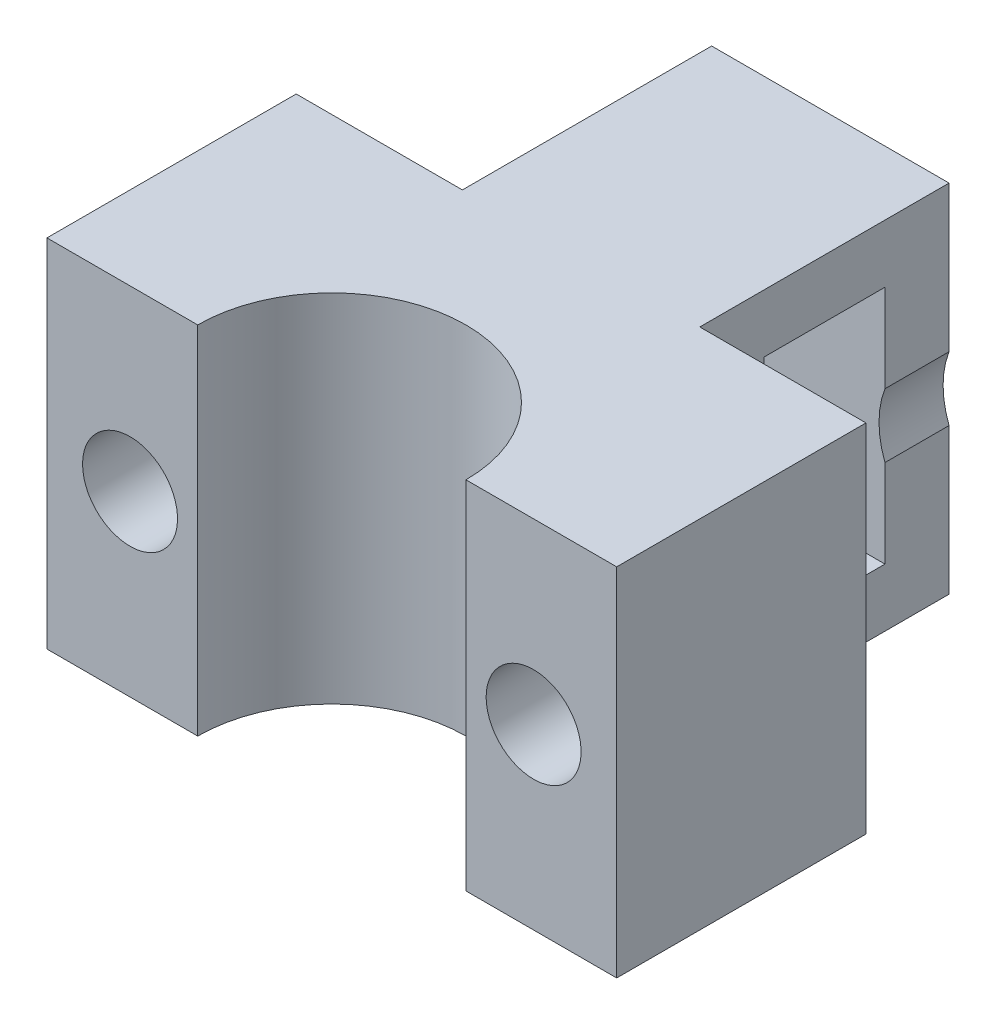
ISO-10303-21;
HEADER;
FILE_DESCRIPTION(('STEP AP214'),'2;1');
FILE_NAME('part.step','',(''),(''),'','','');
FILE_SCHEMA(('AUTOMOTIVE_DESIGN { 1 0 10303 214 1 1 1 1 }'));
ENDSEC;
DATA;
#1=APPLICATION_CONTEXT('core data for automotive mechanical design processes');
#2=APPLICATION_PROTOCOL_DEFINITION('international standard','automotive_design',2000,#1);
#3=PRODUCT_CONTEXT('',#1,'mechanical');
#4=PRODUCT('Part','Part','',(#3));
#5=PRODUCT_RELATED_PRODUCT_CATEGORY('part','',(#4));
#6=PRODUCT_DEFINITION_FORMATION('','',#4);
#7=PRODUCT_DEFINITION_CONTEXT('part definition',#1,'design');
#8=PRODUCT_DEFINITION('design','',#6,#7);
#9=PRODUCT_DEFINITION_SHAPE('','',#8);
#10=(LENGTH_UNIT() NAMED_UNIT(*) SI_UNIT(.MILLI.,.METRE.));
#11=(NAMED_UNIT(*) PLANE_ANGLE_UNIT() SI_UNIT($,.RADIAN.));
#12=(NAMED_UNIT(*) SI_UNIT($,.STERADIAN.) SOLID_ANGLE_UNIT());
#13=UNCERTAINTY_MEASURE_WITH_UNIT(LENGTH_MEASURE(1.E-05),#10,'distance_accuracy_value','');
#14=(GEOMETRIC_REPRESENTATION_CONTEXT(3) GLOBAL_UNCERTAINTY_ASSIGNED_CONTEXT((#13)) GLOBAL_UNIT_ASSIGNED_CONTEXT((#10,
#11,#12)) REPRESENTATION_CONTEXT('',''));
#15=CARTESIAN_POINT('',(0.,0.,0.));
#16=DIRECTION('',(0.,0.,1.));
#17=DIRECTION('',(1.,0.,0.));
#18=AXIS2_PLACEMENT_3D('',#15,#16,#17);
#19=CARTESIAN_POINT('',(-10.,0.,0.));
#20=DIRECTION('',(1.,0.,0.));
#21=DIRECTION('',(0.,0.,-1.));
#22=AXIS2_PLACEMENT_3D('',#19,#20,#21);
#23=PLANE('',#22);
#24=DIRECTION('',(0.,0.,1.));
#25=VECTOR('',#24,1.);
#26=CARTESIAN_POINT('',(-10.,17.6925824035673,-32.));
#27=LINE('',#26,#25);
#28=CARTESIAN_POINT('',(-10.,17.6925824035673,-11.));
#29=VERTEX_POINT('',#28);
#30=CARTESIAN_POINT('',(-10.,17.6925824035673,-16.4));
#31=VERTEX_POINT('',#30);
#32=EDGE_CURVE('E388',#29,#31,#27,.F.);
#33=ORIENTED_EDGE('',*,*,#32,.F.);
#34=DIRECTION('',(0.,1.,0.));
#35=VECTOR('',#34,1.);
#36=CARTESIAN_POINT('',(-10.,0.,-11.));
#37=LINE('',#36,#35);
#38=CARTESIAN_POINT('',(-10.,30.,-11.));
#39=VERTEX_POINT('',#38);
#40=EDGE_CURVE('E269',#29,#39,#37,.T.);
#41=ORIENTED_EDGE('',*,*,#40,.T.);
#42=DIRECTION('',(0.,0.,-1.));
#43=VECTOR('',#42,1.);
#44=CARTESIAN_POINT('',(-10.,30.,-11.));
#45=LINE('',#44,#43);
#46=CARTESIAN_POINT('',(-10.,30.,-32.));
#47=VERTEX_POINT('',#46);
#48=EDGE_CURVE('E273',#39,#47,#45,.T.);
#49=ORIENTED_EDGE('',*,*,#48,.T.);
#50=DIRECTION('',(0.,-1.,0.));
#51=VECTOR('',#50,1.);
#52=CARTESIAN_POINT('',(-10.,0.,-32.));
#53=LINE('',#52,#51);
#54=CARTESIAN_POINT('',(-10.,17.6925824035673,-32.));
#55=VERTEX_POINT('',#54);
#56=EDGE_CURVE('E276',#47,#55,#53,.T.);
#57=ORIENTED_EDGE('',*,*,#56,.T.);
#58=CARTESIAN_POINT('',(-10.,17.6925824035673,-26.6));
#59=VERTEX_POINT('',#58);
#60=EDGE_CURVE('E338',#59,#55,#27,.F.);
#61=ORIENTED_EDGE('',*,*,#60,.F.);
#62=DIRECTION('',(0.,-1.,0.));
#63=VECTOR('',#62,1.);
#64=CARTESIAN_POINT('',(-10.,4.9,-26.6));
#65=LINE('',#64,#63);
#66=CARTESIAN_POINT('',(-10.,25.1,-26.6));
#67=VERTEX_POINT('',#66);
#68=EDGE_CURVE('E367',#67,#59,#65,.T.);
#69=ORIENTED_EDGE('',*,*,#68,.F.);
#70=DIRECTION('',(0.,0.,-1.));
#71=VECTOR('',#70,1.);
#72=CARTESIAN_POINT('',(-10.,25.1,-16.4));
#73=LINE('',#72,#71);
#74=CARTESIAN_POINT('',(-10.,25.1,-16.4));
#75=VERTEX_POINT('',#74);
#76=EDGE_CURVE('E363',#75,#67,#73,.T.);
#77=ORIENTED_EDGE('',*,*,#76,.F.);
#78=DIRECTION('',(0.,1.,0.));
#79=VECTOR('',#78,1.);
#80=CARTESIAN_POINT('',(-10.,4.9,-16.4));
#81=LINE('',#80,#79);
#82=EDGE_CURVE('E359',#31,#75,#81,.T.);
#83=ORIENTED_EDGE('',*,*,#82,.F.);
#84=EDGE_LOOP('',(#33,#41,#49,#57,#61,#69,#77,#83));
#85=FACE_BOUND('',#84,.T.);
#86=ADVANCED_FACE('F35',(#85),#23,.F.);
#87=DIRECTION('',(0.,0.,1.));
#88=VECTOR('',#87,1.);
#89=CARTESIAN_POINT('',(-10.,12.3074175964327,-32.));
#90=LINE('',#89,#88);
#91=CARTESIAN_POINT('',(-10.,12.3074175964327,-32.));
#92=VERTEX_POINT('',#91);
#93=CARTESIAN_POINT('',(-10.,12.3074175964327,-26.6));
#94=VERTEX_POINT('',#93);
#95=EDGE_CURVE('E58',#92,#94,#90,.T.);
#96=ORIENTED_EDGE('',*,*,#95,.F.);
#97=CARTESIAN_POINT('',(-10.,0.,-32.));
#98=VERTEX_POINT('',#97);
#99=EDGE_CURVE('E275',#92,#98,#53,.T.);
#100=ORIENTED_EDGE('',*,*,#99,.T.);
#101=DIRECTION('',(0.,0.,1.));
#102=VECTOR('',#101,1.);
#103=CARTESIAN_POINT('',(-10.,0.,-11.));
#104=LINE('',#103,#102);
#105=CARTESIAN_POINT('',(-10.,0.,-11.));
#106=VERTEX_POINT('',#105);
#107=EDGE_CURVE('E266',#98,#106,#104,.T.);
#108=ORIENTED_EDGE('',*,*,#107,.T.);
#109=CARTESIAN_POINT('',(-10.,12.3074175964327,-11.));
#110=VERTEX_POINT('',#109);
#111=EDGE_CURVE('E270',#106,#110,#37,.T.);
#112=ORIENTED_EDGE('',*,*,#111,.T.);
#113=CARTESIAN_POINT('',(-10.,12.3074175964327,-16.4));
#114=VERTEX_POINT('',#113);
#115=EDGE_CURVE('E385',#114,#110,#90,.T.);
#116=ORIENTED_EDGE('',*,*,#115,.F.);
#117=CARTESIAN_POINT('',(-10.,4.9,-16.4));
#118=VERTEX_POINT('',#117);
#119=EDGE_CURVE('E360',#118,#114,#81,.T.);
#120=ORIENTED_EDGE('',*,*,#119,.F.);
#121=DIRECTION('',(0.,0.,1.));
#122=VECTOR('',#121,1.);
#123=CARTESIAN_POINT('',(-10.,4.9,-16.4));
#124=LINE('',#123,#122);
#125=CARTESIAN_POINT('',(-10.,4.9,-26.6));
#126=VERTEX_POINT('',#125);
#127=EDGE_CURVE('E355',#126,#118,#124,.T.);
#128=ORIENTED_EDGE('',*,*,#127,.F.);
#129=EDGE_CURVE('E366',#94,#126,#65,.T.);
#130=ORIENTED_EDGE('',*,*,#129,.F.);
#131=EDGE_LOOP('',(#96,#100,#108,#112,#116,#120,#128,#130));
#132=FACE_BOUND('',#131,.T.);
#133=ADVANCED_FACE('F383',(#132),#23,.F.);
#134=CARTESIAN_POINT('',(10.,0.,0.));
#135=DIRECTION('',(1.,0.,0.));
#136=DIRECTION('',(0.,0.,-1.));
#137=AXIS2_PLACEMENT_3D('',#134,#135,#136);
#138=PLANE('',#137);
#139=DIRECTION('',(0.,-1.,0.));
#140=VECTOR('',#139,1.);
#141=CARTESIAN_POINT('',(10.,0.,-11.));
#142=LINE('',#141,#140);
#143=CARTESIAN_POINT('',(10.,30.,-11.));
#144=VERTEX_POINT('',#143);
#145=CARTESIAN_POINT('',(10.,17.6925824035672,-11.));
#146=VERTEX_POINT('',#145);
#147=EDGE_CURVE('E241',#144,#146,#142,.T.);
#148=ORIENTED_EDGE('',*,*,#147,.T.);
#149=DIRECTION('',(0.,0.,1.));
#150=VECTOR('',#149,1.);
#151=CARTESIAN_POINT('',(10.,17.6925824035672,-32.));
#152=LINE('',#151,#150);
#153=CARTESIAN_POINT('',(10.,17.6925824035672,-16.4));
#154=VERTEX_POINT('',#153);
#155=EDGE_CURVE('E227',#146,#154,#152,.F.);
#156=ORIENTED_EDGE('',*,*,#155,.T.);
#157=DIRECTION('',(0.,-1.,0.));
#158=VECTOR('',#157,1.);
#159=CARTESIAN_POINT('',(10.,0.,-16.4));
#160=LINE('',#159,#158);
#161=CARTESIAN_POINT('',(10.,25.1,-16.4));
#162=VERTEX_POINT('',#161);
#163=EDGE_CURVE('E239',#162,#154,#160,.T.);
#164=ORIENTED_EDGE('',*,*,#163,.F.);
#165=DIRECTION('',(0.,0.,1.));
#166=VECTOR('',#165,1.);
#167=CARTESIAN_POINT('',(10.,25.1,0.));
#168=LINE('',#167,#166);
#169=CARTESIAN_POINT('',(10.,25.1,-26.6));
#170=VERTEX_POINT('',#169);
#171=EDGE_CURVE('E250',#170,#162,#168,.T.);
#172=ORIENTED_EDGE('',*,*,#171,.F.);
#173=DIRECTION('',(0.,1.,0.));
#174=VECTOR('',#173,1.);
#175=CARTESIAN_POINT('',(10.,0.,-26.6));
#176=LINE('',#175,#174);
#177=CARTESIAN_POINT('',(10.,17.6925824035672,-26.6));
#178=VERTEX_POINT('',#177);
#179=EDGE_CURVE('E253',#178,#170,#176,.T.);
#180=ORIENTED_EDGE('',*,*,#179,.F.);
#181=CARTESIAN_POINT('',(10.,17.6925824035672,-32.));
#182=VERTEX_POINT('',#181);
#183=EDGE_CURVE('E244',#178,#182,#152,.F.);
#184=ORIENTED_EDGE('',*,*,#183,.T.);
#185=DIRECTION('',(0.,1.,0.));
#186=VECTOR('',#185,1.);
#187=CARTESIAN_POINT('',(10.,0.,-32.));
#188=LINE('',#187,#186);
#189=CARTESIAN_POINT('',(10.,30.,-32.));
#190=VERTEX_POINT('',#189);
#191=EDGE_CURVE('E289',#182,#190,#188,.T.);
#192=ORIENTED_EDGE('',*,*,#191,.T.);
#193=DIRECTION('',(0.,0.,1.));
#194=VECTOR('',#193,1.);
#195=CARTESIAN_POINT('',(10.,30.,-11.));
#196=LINE('',#195,#194);
#197=EDGE_CURVE('E293',#190,#144,#196,.T.);
#198=ORIENTED_EDGE('',*,*,#197,.T.);
#199=EDGE_LOOP('',(#148,#156,#164,#172,#180,#184,#192,#198));
#200=FACE_BOUND('',#199,.T.);
#201=ADVANCED_FACE('F237',(#200),#138,.T.);
#202=CARTESIAN_POINT('',(10.,0.,-32.));
#203=VERTEX_POINT('',#202);
#204=CARTESIAN_POINT('',(10.,12.3074175964328,-32.));
#205=VERTEX_POINT('',#204);
#206=EDGE_CURVE('E290',#203,#205,#188,.T.);
#207=ORIENTED_EDGE('',*,*,#206,.T.);
#208=DIRECTION('',(0.,0.,1.));
#209=VECTOR('',#208,1.);
#210=CARTESIAN_POINT('',(10.,12.3074175964328,-32.));
#211=LINE('',#210,#209);
#212=CARTESIAN_POINT('',(10.,12.3074175964328,-26.6));
#213=VERTEX_POINT('',#212);
#214=EDGE_CURVE('E337',#205,#213,#211,.T.);
#215=ORIENTED_EDGE('',*,*,#214,.T.);
#216=CARTESIAN_POINT('',(10.,4.9,-26.6));
#217=VERTEX_POINT('',#216);
#218=EDGE_CURVE('E260',#217,#213,#176,.T.);
#219=ORIENTED_EDGE('',*,*,#218,.F.);
#220=DIRECTION('',(0.,0.,-1.));
#221=VECTOR('',#220,1.);
#222=CARTESIAN_POINT('',(10.,4.9,0.));
#223=LINE('',#222,#221);
#224=CARTESIAN_POINT('',(10.,4.9,-16.4));
#225=VERTEX_POINT('',#224);
#226=EDGE_CURVE('E263',#225,#217,#223,.T.);
#227=ORIENTED_EDGE('',*,*,#226,.F.);
#228=CARTESIAN_POINT('',(10.,12.3074175964328,-16.4));
#229=VERTEX_POINT('',#228);
#230=EDGE_CURVE('E251',#229,#225,#160,.T.);
#231=ORIENTED_EDGE('',*,*,#230,.F.);
#232=CARTESIAN_POINT('',(10.,12.3074175964328,-11.));
#233=VERTEX_POINT('',#232);
#234=EDGE_CURVE('E230',#229,#233,#211,.T.);
#235=ORIENTED_EDGE('',*,*,#234,.T.);
#236=CARTESIAN_POINT('',(10.,0.,-11.));
#237=VERTEX_POINT('',#236);
#238=EDGE_CURVE('E295',#233,#237,#142,.T.);
#239=ORIENTED_EDGE('',*,*,#238,.T.);
#240=DIRECTION('',(0.,0.,-1.));
#241=VECTOR('',#240,1.);
#242=CARTESIAN_POINT('',(10.,0.,-11.));
#243=LINE('',#242,#241);
#244=EDGE_CURVE('E286',#237,#203,#243,.T.);
#245=ORIENTED_EDGE('',*,*,#244,.T.);
#246=EDGE_LOOP('',(#207,#215,#219,#227,#231,#235,#239,#245));
#247=FACE_BOUND('',#246,.T.);
#248=ADVANCED_FACE('F323',(#247),#138,.T.);
#249=CARTESIAN_POINT('',(-24.,0.,-32.));
#250=DIRECTION('',(0.,0.,1.));
#251=DIRECTION('',(1.,0.,0.));
#252=AXIS2_PLACEMENT_3D('',#249,#250,#251);
#253=PLANE('',#252);
#254=CARTESIAN_POINT('',(-17.,15.,-32.));
#255=DIRECTION('',(0.,0.,-1.));
#256=DIRECTION('',(-1.,0.,0.));
#257=AXIS2_PLACEMENT_3D('',#254,#255,#256);
#258=CIRCLE('',#257,7.5);
#259=EDGE_CURVE('E389',#55,#92,#258,.T.);
#260=ORIENTED_EDGE('',*,*,#259,.F.);
#261=ORIENTED_EDGE('',*,*,#56,.F.);
#262=DIRECTION('',(1.,0.,0.));
#263=VECTOR('',#262,1.);
#264=CARTESIAN_POINT('',(-24.,30.,-32.));
#265=LINE('',#264,#263);
#266=EDGE_CURVE('E214',#47,#190,#265,.T.);
#267=ORIENTED_EDGE('',*,*,#266,.T.);
#268=ORIENTED_EDGE('',*,*,#191,.F.);
#269=CARTESIAN_POINT('',(17.,15.,-32.));
#270=DIRECTION('',(0.,0.,-1.));
#271=DIRECTION('',(-1.,0.,0.));
#272=AXIS2_PLACEMENT_3D('',#269,#270,#271);
#273=CIRCLE('',#272,7.5);
#274=EDGE_CURVE('E331',#205,#182,#273,.T.);
#275=ORIENTED_EDGE('',*,*,#274,.F.);
#276=ORIENTED_EDGE('',*,*,#206,.F.);
#277=DIRECTION('',(1.,0.,0.));
#278=VECTOR('',#277,1.);
#279=CARTESIAN_POINT('',(-24.,0.,-32.));
#280=LINE('',#279,#278);
#281=EDGE_CURVE('E302',#98,#203,#280,.T.);
#282=ORIENTED_EDGE('',*,*,#281,.F.);
#283=ORIENTED_EDGE('',*,*,#99,.F.);
#284=EDGE_LOOP('',(#260,#261,#267,#268,#275,#276,#282,#283));
#285=FACE_BOUND('',#284,.T.);
#286=ADVANCED_FACE('F328',(#285),#253,.F.);
#287=CARTESIAN_POINT('',(-24.,30.,10.));
#288=DIRECTION('',(0.,0.,-1.));
#289=DIRECTION('',(-1.,0.,0.));
#290=AXIS2_PLACEMENT_3D('',#287,#288,#289);
#291=PLANE('',#290);
#292=CARTESIAN_POINT('',(17.,15.,10.));
#293=DIRECTION('',(0.,0.,-1.));
#294=DIRECTION('',(-1.,0.,0.));
#295=AXIS2_PLACEMENT_3D('',#292,#293,#294);
#296=CIRCLE('',#295,4.);
#297=CARTESIAN_POINT('',(13.,15.,10.));
#298=VERTEX_POINT('',#297);
#299=EDGE_CURVE('E345',#298,#298,#296,.T.);
#300=ORIENTED_EDGE('',*,*,#299,.T.);
#301=EDGE_LOOP('',(#300));
#302=FACE_BOUND('',#301,.T.);
#303=DIRECTION('',(1.,0.,0.));
#304=VECTOR('',#303,1.);
#305=CARTESIAN_POINT('',(-24.,30.,10.));
#306=LINE('',#305,#304);
#307=CARTESIAN_POINT('',(11.3,30.,10.));
#308=VERTEX_POINT('',#307);
#309=CARTESIAN_POINT('',(24.,30.,10.));
#310=VERTEX_POINT('',#309);
#311=EDGE_CURVE('E195',#308,#310,#306,.T.);
#312=ORIENTED_EDGE('',*,*,#311,.F.);
#313=DIRECTION('',(0.,1.,0.));
#314=VECTOR('',#313,1.);
#315=CARTESIAN_POINT('',(11.3,0.,10.));
#316=LINE('',#315,#314);
#317=CARTESIAN_POINT('',(11.3,0.,10.));
#318=VERTEX_POINT('',#317);
#319=EDGE_CURVE('E181',#308,#318,#316,.F.);
#320=ORIENTED_EDGE('',*,*,#319,.T.);
#321=DIRECTION('',(1.,0.,0.));
#322=VECTOR('',#321,1.);
#323=CARTESIAN_POINT('',(-24.,0.,10.));
#324=LINE('',#323,#322);
#325=CARTESIAN_POINT('',(24.,0.,10.));
#326=VERTEX_POINT('',#325);
#327=EDGE_CURVE('E216',#318,#326,#324,.T.);
#328=ORIENTED_EDGE('',*,*,#327,.T.);
#329=DIRECTION('',(0.,-1.,0.));
#330=VECTOR('',#329,1.);
#331=CARTESIAN_POINT('',(24.,30.,10.));
#332=LINE('',#331,#330);
#333=EDGE_CURVE('E202',#310,#326,#332,.T.);
#334=ORIENTED_EDGE('',*,*,#333,.F.);
#335=EDGE_LOOP('',(#312,#320,#328,#334));
#336=FACE_BOUND('',#335,.T.);
#337=ADVANCED_FACE('F200',(#302,#336),#291,.F.);
#338=CARTESIAN_POINT('',(24.,30.,10.));
#339=DIRECTION('',(-1.,0.,0.));
#340=DIRECTION('',(0.,0.,1.));
#341=AXIS2_PLACEMENT_3D('',#338,#339,#340);
#342=PLANE('',#341);
#343=DIRECTION('',(0.,0.,-1.));
#344=VECTOR('',#343,1.);
#345=CARTESIAN_POINT('',(24.,0.,10.));
#346=LINE('',#345,#344);
#347=CARTESIAN_POINT('',(24.,0.,-11.));
#348=VERTEX_POINT('',#347);
#349=EDGE_CURVE('E210',#326,#348,#346,.T.);
#350=ORIENTED_EDGE('',*,*,#349,.T.);
#351=DIRECTION('',(0.,-1.,0.));
#352=VECTOR('',#351,1.);
#353=CARTESIAN_POINT('',(24.,0.,-11.));
#354=LINE('',#353,#352);
#355=CARTESIAN_POINT('',(24.,30.,-11.));
#356=VERTEX_POINT('',#355);
#357=EDGE_CURVE('E284',#356,#348,#354,.T.);
#358=ORIENTED_EDGE('',*,*,#357,.F.);
#359=DIRECTION('',(0.,0.,-1.));
#360=VECTOR('',#359,1.);
#361=CARTESIAN_POINT('',(24.,30.,10.));
#362=LINE('',#361,#360);
#363=EDGE_CURVE('E206',#310,#356,#362,.T.);
#364=ORIENTED_EDGE('',*,*,#363,.F.);
#365=ORIENTED_EDGE('',*,*,#333,.T.);
#366=EDGE_LOOP('',(#350,#358,#364,#365));
#367=FACE_BOUND('',#366,.T.);
#368=ADVANCED_FACE('F37',(#367),#342,.F.);
#369=CARTESIAN_POINT('',(-24.,30.,10.));
#370=DIRECTION('',(1.,0.,0.));
#371=DIRECTION('',(0.,0.,-1.));
#372=AXIS2_PLACEMENT_3D('',#369,#370,#371);
#373=PLANE('',#372);
#374=DIRECTION('',(0.,0.,1.));
#375=VECTOR('',#374,1.);
#376=CARTESIAN_POINT('',(-24.,30.,10.));
#377=LINE('',#376,#375);
#378=CARTESIAN_POINT('',(-24.,30.,-11.));
#379=VERTEX_POINT('',#378);
#380=CARTESIAN_POINT('',(-24.,30.,10.));
#381=VERTEX_POINT('',#380);
#382=EDGE_CURVE('E204',#379,#381,#377,.T.);
#383=ORIENTED_EDGE('',*,*,#382,.F.);
#384=DIRECTION('',(0.,1.,0.));
#385=VECTOR('',#384,1.);
#386=CARTESIAN_POINT('',(-24.,0.,-11.));
#387=LINE('',#386,#385);
#388=CARTESIAN_POINT('',(-24.,0.,-11.));
#389=VERTEX_POINT('',#388);
#390=EDGE_CURVE('E265',#389,#379,#387,.T.);
#391=ORIENTED_EDGE('',*,*,#390,.F.);
#392=DIRECTION('',(0.,0.,1.));
#393=VECTOR('',#392,1.);
#394=CARTESIAN_POINT('',(-24.,0.,10.));
#395=LINE('',#394,#393);
#396=CARTESIAN_POINT('',(-24.,0.,10.));
#397=VERTEX_POINT('',#396);
#398=EDGE_CURVE('E213',#389,#397,#395,.T.);
#399=ORIENTED_EDGE('',*,*,#398,.T.);
#400=DIRECTION('',(0.,-1.,0.));
#401=VECTOR('',#400,1.);
#402=CARTESIAN_POINT('',(-24.,30.,10.));
#403=LINE('',#402,#401);
#404=EDGE_CURVE('E221',#381,#397,#403,.T.);
#405=ORIENTED_EDGE('',*,*,#404,.F.);
#406=EDGE_LOOP('',(#383,#391,#399,#405));
#407=FACE_BOUND('',#406,.T.);
#408=ADVANCED_FACE('F418',(#407),#373,.F.);
#409=CARTESIAN_POINT('',(-17.,15.,10.));
#410=DIRECTION('',(0.,0.,-1.));
#411=DIRECTION('',(-1.,0.,0.));
#412=AXIS2_PLACEMENT_3D('',#409,#410,#411);
#413=CIRCLE('',#412,4.);
#414=CARTESIAN_POINT('',(-21.,15.,10.));
#415=VERTEX_POINT('',#414);
#416=EDGE_CURVE('E352',#415,#415,#413,.T.);
#417=ORIENTED_EDGE('',*,*,#416,.T.);
#418=EDGE_LOOP('',(#417));
#419=FACE_BOUND('',#418,.T.);
#420=CARTESIAN_POINT('',(-11.3,0.,10.));
#421=VERTEX_POINT('',#420);
#422=EDGE_CURVE('E217',#397,#421,#324,.T.);
#423=ORIENTED_EDGE('',*,*,#422,.T.);
#424=DIRECTION('',(0.,1.,0.));
#425=VECTOR('',#424,1.);
#426=CARTESIAN_POINT('',(-11.3,0.,10.));
#427=LINE('',#426,#425);
#428=CARTESIAN_POINT('',(-11.3,30.,10.));
#429=VERTEX_POINT('',#428);
#430=EDGE_CURVE('E50',#421,#429,#427,.T.);
#431=ORIENTED_EDGE('',*,*,#430,.T.);
#432=EDGE_CURVE('E198',#381,#429,#306,.T.);
#433=ORIENTED_EDGE('',*,*,#432,.F.);
#434=ORIENTED_EDGE('',*,*,#404,.T.);
#435=EDGE_LOOP('',(#423,#431,#433,#434));
#436=FACE_BOUND('',#435,.T.);
#437=ADVANCED_FACE('F414',(#419,#436),#291,.F.);
#438=CARTESIAN_POINT('',(0.,30.,0.));
#439=DIRECTION('',(0.,-1.,0.));
#440=DIRECTION('',(0.,0.,-1.));
#441=AXIS2_PLACEMENT_3D('',#438,#439,#440);
#442=PLANE('',#441);
#443=ORIENTED_EDGE('',*,*,#432,.T.);
#444=CARTESIAN_POINT('',(0.,30.,10.));
#445=DIRECTION('',(0.,1.,0.));
#446=DIRECTION('',(0.,0.,1.));
#447=AXIS2_PLACEMENT_3D('',#444,#445,#446);
#448=CIRCLE('',#447,11.3);
#449=EDGE_CURVE('E184',#308,#429,#448,.T.);
#450=ORIENTED_EDGE('',*,*,#449,.F.);
#451=ORIENTED_EDGE('',*,*,#311,.T.);
#452=ORIENTED_EDGE('',*,*,#363,.T.);
#453=DIRECTION('',(1.,0.,0.));
#454=VECTOR('',#453,1.);
#455=CARTESIAN_POINT('',(10.,30.,-11.));
#456=LINE('',#455,#454);
#457=EDGE_CURVE('E297',#144,#356,#456,.T.);
#458=ORIENTED_EDGE('',*,*,#457,.F.);
#459=ORIENTED_EDGE('',*,*,#197,.F.);
#460=ORIENTED_EDGE('',*,*,#266,.F.);
#461=ORIENTED_EDGE('',*,*,#48,.F.);
#462=DIRECTION('',(-1.,0.,0.));
#463=VECTOR('',#462,1.);
#464=CARTESIAN_POINT('',(-10.,30.,-11.));
#465=LINE('',#464,#463);
#466=EDGE_CURVE('E281',#39,#379,#465,.T.);
#467=ORIENTED_EDGE('',*,*,#466,.T.);
#468=ORIENTED_EDGE('',*,*,#382,.T.);
#469=EDGE_LOOP('',(#443,#450,#451,#452,#458,#459,#460,#461,#467,#468));
#470=FACE_BOUND('',#469,.T.);
#471=ADVANCED_FACE('F193',(#470),#442,.F.);
#472=CARTESIAN_POINT('',(0.,0.,0.));
#473=DIRECTION('',(0.,-1.,0.));
#474=DIRECTION('',(0.,0.,-1.));
#475=AXIS2_PLACEMENT_3D('',#472,#473,#474);
#476=PLANE('',#475);
#477=CARTESIAN_POINT('',(0.,0.,10.));
#478=DIRECTION('',(0.,1.,0.));
#479=DIRECTION('',(0.,0.,1.));
#480=AXIS2_PLACEMENT_3D('',#477,#478,#479);
#481=CIRCLE('',#480,11.3);
#482=EDGE_CURVE('E185',#318,#421,#481,.T.);
#483=ORIENTED_EDGE('',*,*,#482,.T.);
#484=ORIENTED_EDGE('',*,*,#422,.F.);
#485=ORIENTED_EDGE('',*,*,#398,.F.);
#486=DIRECTION('',(-1.,0.,0.));
#487=VECTOR('',#486,1.);
#488=CARTESIAN_POINT('',(-10.,0.,-11.));
#489=LINE('',#488,#487);
#490=EDGE_CURVE('E279',#106,#389,#489,.T.);
#491=ORIENTED_EDGE('',*,*,#490,.F.);
#492=ORIENTED_EDGE('',*,*,#107,.F.);
#493=ORIENTED_EDGE('',*,*,#281,.T.);
#494=ORIENTED_EDGE('',*,*,#244,.F.);
#495=DIRECTION('',(1.,0.,0.));
#496=VECTOR('',#495,1.);
#497=CARTESIAN_POINT('',(10.,0.,-11.));
#498=LINE('',#497,#496);
#499=EDGE_CURVE('E299',#237,#348,#498,.T.);
#500=ORIENTED_EDGE('',*,*,#499,.T.);
#501=ORIENTED_EDGE('',*,*,#349,.F.);
#502=ORIENTED_EDGE('',*,*,#327,.F.);
#503=EDGE_LOOP('',(#483,#484,#485,#491,#492,#493,#494,#500,#501,#502));
#504=FACE_BOUND('',#503,.T.);
#505=ADVANCED_FACE('F318',(#504),#476,.T.);
#506=CARTESIAN_POINT('',(10.,0.,-11.));
#507=DIRECTION('',(0.,0.,1.));
#508=DIRECTION('',(0.,-1.,0.));
#509=AXIS2_PLACEMENT_3D('',#506,#507,#508);
#510=PLANE('',#509);
#511=ORIENTED_EDGE('',*,*,#238,.F.);
#512=CARTESIAN_POINT('',(17.,15.,-11.));
#513=DIRECTION('',(0.,0.,-1.));
#514=DIRECTION('',(-1.,0.,0.));
#515=AXIS2_PLACEMENT_3D('',#512,#513,#514);
#516=CIRCLE('',#515,7.5);
#517=EDGE_CURVE('E334',#233,#146,#516,.T.);
#518=ORIENTED_EDGE('',*,*,#517,.T.);
#519=ORIENTED_EDGE('',*,*,#147,.F.);
#520=ORIENTED_EDGE('',*,*,#457,.T.);
#521=ORIENTED_EDGE('',*,*,#357,.T.);
#522=ORIENTED_EDGE('',*,*,#499,.F.);
#523=EDGE_LOOP('',(#511,#518,#519,#520,#521,#522));
#524=FACE_BOUND('',#523,.T.);
#525=CARTESIAN_POINT('',(17.,15.,-11.));
#526=DIRECTION('',(0.,0.,-1.));
#527=DIRECTION('',(-1.,0.,0.));
#528=AXIS2_PLACEMENT_3D('',#525,#526,#527);
#529=CIRCLE('',#528,4.);
#530=CARTESIAN_POINT('',(13.,15.,-11.));
#531=VERTEX_POINT('',#530);
#532=EDGE_CURVE('E349',#531,#531,#529,.T.);
#533=ORIENTED_EDGE('',*,*,#532,.F.);
#534=EDGE_LOOP('',(#533));
#535=FACE_BOUND('',#534,.T.);
#536=ADVANCED_FACE('F314',(#524,#535),#510,.F.);
#537=CARTESIAN_POINT('',(-10.,0.,-11.));
#538=DIRECTION('',(0.,0.,1.));
#539=DIRECTION('',(0.,-1.,0.));
#540=AXIS2_PLACEMENT_3D('',#537,#538,#539);
#541=PLANE('',#540);
#542=ORIENTED_EDGE('',*,*,#390,.T.);
#543=ORIENTED_EDGE('',*,*,#466,.F.);
#544=ORIENTED_EDGE('',*,*,#40,.F.);
#545=CARTESIAN_POINT('',(-17.,15.,-11.));
#546=DIRECTION('',(0.,0.,-1.));
#547=DIRECTION('',(-1.,0.,0.));
#548=AXIS2_PLACEMENT_3D('',#545,#546,#547);
#549=CIRCLE('',#548,7.5);
#550=EDGE_CURVE('E189',#29,#110,#549,.T.);
#551=ORIENTED_EDGE('',*,*,#550,.T.);
#552=ORIENTED_EDGE('',*,*,#111,.F.);
#553=ORIENTED_EDGE('',*,*,#490,.T.);
#554=EDGE_LOOP('',(#542,#543,#544,#551,#552,#553));
#555=FACE_BOUND('',#554,.T.);
#556=CARTESIAN_POINT('',(-17.,15.,-11.));
#557=DIRECTION('',(0.,0.,-1.));
#558=DIRECTION('',(-1.,0.,0.));
#559=AXIS2_PLACEMENT_3D('',#556,#557,#558);
#560=CIRCLE('',#559,4.);
#561=CARTESIAN_POINT('',(-21.,15.,-11.));
#562=VERTEX_POINT('',#561);
#563=EDGE_CURVE('E348',#562,#562,#560,.T.);
#564=ORIENTED_EDGE('',*,*,#563,.F.);
#565=EDGE_LOOP('',(#564));
#566=FACE_BOUND('',#565,.T.);
#567=ADVANCED_FACE('F421',(#555,#566),#541,.F.);
#568=CARTESIAN_POINT('',(24.,4.9,-16.4));
#569=DIRECTION('',(0.,-1.,0.));
#570=DIRECTION('',(0.,0.,-1.));
#571=AXIS2_PLACEMENT_3D('',#568,#569,#570);
#572=PLANE('',#571);
#573=ORIENTED_EDGE('',*,*,#226,.T.);
#574=DIRECTION('',(-1.,0.,0.));
#575=VECTOR('',#574,1.);
#576=CARTESIAN_POINT('',(24.,4.9,-26.6));
#577=LINE('',#576,#575);
#578=EDGE_CURVE('E255',#217,#126,#577,.T.);
#579=ORIENTED_EDGE('',*,*,#578,.T.);
#580=ORIENTED_EDGE('',*,*,#127,.T.);
#581=DIRECTION('',(-1.,0.,0.));
#582=VECTOR('',#581,1.);
#583=CARTESIAN_POINT('',(24.,4.9,-16.4));
#584=LINE('',#583,#582);
#585=EDGE_CURVE('E257',#225,#118,#584,.T.);
#586=ORIENTED_EDGE('',*,*,#585,.F.);
#587=EDGE_LOOP('',(#573,#579,#580,#586));
#588=FACE_BOUND('',#587,.T.);
#589=ADVANCED_FACE('F428',(#588),#572,.F.);
#590=CARTESIAN_POINT('',(24.,4.9,-26.6));
#591=DIRECTION('',(0.,0.,-1.));
#592=DIRECTION('',(-1.,0.,0.));
#593=AXIS2_PLACEMENT_3D('',#590,#591,#592);
#594=PLANE('',#593);
#595=CARTESIAN_POINT('',(-17.,15.,-26.6));
#596=DIRECTION('',(0.,0.,-1.));
#597=DIRECTION('',(-1.,0.,0.));
#598=AXIS2_PLACEMENT_3D('',#595,#596,#597);
#599=CIRCLE('',#598,7.5);
#600=EDGE_CURVE('E341',#94,#59,#599,.F.);
#601=ORIENTED_EDGE('',*,*,#600,.F.);
#602=ORIENTED_EDGE('',*,*,#129,.T.);
#603=ORIENTED_EDGE('',*,*,#578,.F.);
#604=ORIENTED_EDGE('',*,*,#218,.T.);
#605=CARTESIAN_POINT('',(17.,15.,-26.6));
#606=DIRECTION('',(0.,0.,-1.));
#607=DIRECTION('',(-1.,0.,0.));
#608=AXIS2_PLACEMENT_3D('',#605,#606,#607);
#609=CIRCLE('',#608,7.5);
#610=EDGE_CURVE('E242',#178,#213,#609,.F.);
#611=ORIENTED_EDGE('',*,*,#610,.F.);
#612=ORIENTED_EDGE('',*,*,#179,.T.);
#613=DIRECTION('',(-1.,0.,0.));
#614=VECTOR('',#613,1.);
#615=CARTESIAN_POINT('',(24.,25.1,-26.6));
#616=LINE('',#615,#614);
#617=EDGE_CURVE('E372',#170,#67,#616,.T.);
#618=ORIENTED_EDGE('',*,*,#617,.T.);
#619=ORIENTED_EDGE('',*,*,#68,.T.);
#620=EDGE_LOOP('',(#601,#602,#603,#604,#611,#612,#618,#619));
#621=FACE_BOUND('',#620,.T.);
#622=ADVANCED_FACE('F400',(#621),#594,.F.);
#623=CARTESIAN_POINT('',(24.,25.1,-16.4));
#624=DIRECTION('',(0.,1.,0.));
#625=DIRECTION('',(0.,0.,1.));
#626=AXIS2_PLACEMENT_3D('',#623,#624,#625);
#627=PLANE('',#626);
#628=ORIENTED_EDGE('',*,*,#171,.T.);
#629=DIRECTION('',(-1.,0.,0.));
#630=VECTOR('',#629,1.);
#631=CARTESIAN_POINT('',(24.,25.1,-16.4));
#632=LINE('',#631,#630);
#633=EDGE_CURVE('E248',#162,#75,#632,.T.);
#634=ORIENTED_EDGE('',*,*,#633,.T.);
#635=ORIENTED_EDGE('',*,*,#76,.T.);
#636=ORIENTED_EDGE('',*,*,#617,.F.);
#637=EDGE_LOOP('',(#628,#634,#635,#636));
#638=FACE_BOUND('',#637,.T.);
#639=ADVANCED_FACE('F404',(#638),#627,.F.);
#640=CARTESIAN_POINT('',(24.,4.9,-16.4));
#641=DIRECTION('',(0.,0.,1.));
#642=DIRECTION('',(1.,0.,0.));
#643=AXIS2_PLACEMENT_3D('',#640,#641,#642);
#644=PLANE('',#643);
#645=CARTESIAN_POINT('',(-17.,15.,-16.4));
#646=DIRECTION('',(0.,0.,1.));
#647=DIRECTION('',(1.,0.,0.));
#648=AXIS2_PLACEMENT_3D('',#645,#646,#647);
#649=CIRCLE('',#648,7.5);
#650=EDGE_CURVE('E11',#31,#114,#649,.F.);
#651=ORIENTED_EDGE('',*,*,#650,.F.);
#652=ORIENTED_EDGE('',*,*,#82,.T.);
#653=ORIENTED_EDGE('',*,*,#633,.F.);
#654=ORIENTED_EDGE('',*,*,#163,.T.);
#655=CARTESIAN_POINT('',(17.,15.,-16.4));
#656=DIRECTION('',(0.,0.,1.));
#657=DIRECTION('',(1.,0.,0.));
#658=AXIS2_PLACEMENT_3D('',#655,#656,#657);
#659=CIRCLE('',#658,7.5);
#660=EDGE_CURVE('E43',#229,#154,#659,.F.);
#661=ORIENTED_EDGE('',*,*,#660,.F.);
#662=ORIENTED_EDGE('',*,*,#230,.T.);
#663=ORIENTED_EDGE('',*,*,#585,.T.);
#664=ORIENTED_EDGE('',*,*,#119,.T.);
#665=EDGE_LOOP('',(#651,#652,#653,#654,#661,#662,#663,#664));
#666=FACE_BOUND('',#665,.T.);
#667=ADVANCED_FACE('F246',(#666),#644,.F.);
#668=CARTESIAN_POINT('',(-17.,15.,10.));
#669=DIRECTION('',(0.,0.,-1.));
#670=DIRECTION('',(-1.,0.,0.));
#671=AXIS2_PLACEMENT_3D('',#668,#669,#670);
#672=CYLINDRICAL_SURFACE('',#671,4.);
#673=ORIENTED_EDGE('',*,*,#416,.F.);
#674=EDGE_LOOP('',(#673));
#675=FACE_BOUND('',#674,.T.);
#676=ORIENTED_EDGE('',*,*,#563,.T.);
#677=EDGE_LOOP('',(#676));
#678=FACE_BOUND('',#677,.T.);
#679=ADVANCED_FACE('F475',(#675,#678),#672,.F.);
#680=CARTESIAN_POINT('',(17.,15.,10.));
#681=DIRECTION('',(0.,0.,-1.));
#682=DIRECTION('',(-1.,0.,0.));
#683=AXIS2_PLACEMENT_3D('',#680,#681,#682);
#684=CYLINDRICAL_SURFACE('',#683,4.);
#685=ORIENTED_EDGE('',*,*,#299,.F.);
#686=EDGE_LOOP('',(#685));
#687=FACE_BOUND('',#686,.T.);
#688=ORIENTED_EDGE('',*,*,#532,.T.);
#689=EDGE_LOOP('',(#688));
#690=FACE_BOUND('',#689,.T.);
#691=ADVANCED_FACE('F437',(#687,#690),#684,.F.);
#692=CARTESIAN_POINT('',(17.,15.,-32.));
#693=DIRECTION('',(0.,0.,1.));
#694=DIRECTION('',(1.,0.,0.));
#695=AXIS2_PLACEMENT_3D('',#692,#693,#694);
#696=CYLINDRICAL_SURFACE('',#695,7.5);
#697=ORIENTED_EDGE('',*,*,#517,.F.);
#698=ORIENTED_EDGE('',*,*,#234,.F.);
#699=ORIENTED_EDGE('',*,*,#660,.T.);
#700=ORIENTED_EDGE('',*,*,#155,.F.);
#701=EDGE_LOOP('',(#697,#698,#699,#700));
#702=FACE_BOUND('',#701,.T.);
#703=ADVANCED_FACE('F226',(#702),#696,.F.);
#704=ORIENTED_EDGE('',*,*,#610,.T.);
#705=ORIENTED_EDGE('',*,*,#214,.F.);
#706=ORIENTED_EDGE('',*,*,#274,.T.);
#707=ORIENTED_EDGE('',*,*,#183,.F.);
#708=EDGE_LOOP('',(#704,#705,#706,#707));
#709=FACE_BOUND('',#708,.T.);
#710=ADVANCED_FACE('F429',(#709),#696,.F.);
#711=CARTESIAN_POINT('',(-17.,15.,-32.));
#712=DIRECTION('',(0.,0.,1.));
#713=DIRECTION('',(1.,0.,0.));
#714=AXIS2_PLACEMENT_3D('',#711,#712,#713);
#715=CYLINDRICAL_SURFACE('',#714,7.5);
#716=ORIENTED_EDGE('',*,*,#32,.T.);
#717=ORIENTED_EDGE('',*,*,#650,.T.);
#718=ORIENTED_EDGE('',*,*,#115,.T.);
#719=ORIENTED_EDGE('',*,*,#550,.F.);
#720=EDGE_LOOP('',(#716,#717,#718,#719));
#721=FACE_BOUND('',#720,.T.);
#722=ADVANCED_FACE('F407',(#721),#715,.F.);
#723=ORIENTED_EDGE('',*,*,#60,.T.);
#724=ORIENTED_EDGE('',*,*,#259,.T.);
#725=ORIENTED_EDGE('',*,*,#95,.T.);
#726=ORIENTED_EDGE('',*,*,#600,.T.);
#727=EDGE_LOOP('',(#723,#724,#725,#726));
#728=FACE_BOUND('',#727,.T.);
#729=ADVANCED_FACE('F394',(#728),#715,.F.);
#730=CARTESIAN_POINT('',(0.,0.,10.));
#731=DIRECTION('',(0.,1.,0.));
#732=DIRECTION('',(0.,0.,1.));
#733=AXIS2_PLACEMENT_3D('',#730,#731,#732);
#734=CYLINDRICAL_SURFACE('',#733,11.3);
#735=ORIENTED_EDGE('',*,*,#449,.T.);
#736=ORIENTED_EDGE('',*,*,#430,.F.);
#737=ORIENTED_EDGE('',*,*,#482,.F.);
#738=ORIENTED_EDGE('',*,*,#319,.F.);
#739=EDGE_LOOP('',(#735,#736,#737,#738));
#740=FACE_BOUND('',#739,.T.);
#741=ADVANCED_FACE('F183',(#740),#734,.F.);
#742=CLOSED_SHELL('',(#86,#133,#201,#248,#286,#337,#368,#408,#437,#471,#505,#536,#567,#589,#622,
#639,#667,#679,#691,#703,#710,#722,#729,#741));
#743=MANIFOLD_SOLID_BREP('B2',#742);
#744=ADVANCED_BREP_SHAPE_REPRESENTATION('',(#18,#743),#14);
#745=SHAPE_DEFINITION_REPRESENTATION(#9,#744);
ENDSEC;
END-ISO-10303-21;
